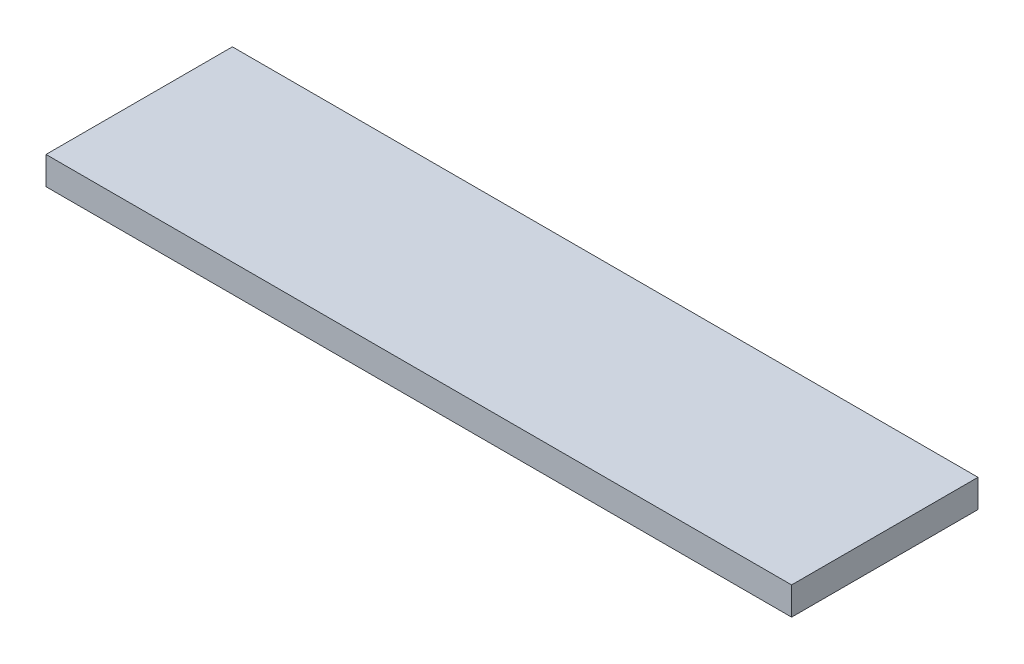
ISO-10303-21;
HEADER;
FILE_DESCRIPTION(('STEP AP214'),'2;1');
FILE_NAME('part.step','',(''),(''),'','','');
FILE_SCHEMA(('AUTOMOTIVE_DESIGN { 1 0 10303 214 1 1 1 1 }'));
ENDSEC;
DATA;
#1=APPLICATION_CONTEXT('core data for automotive mechanical design processes');
#2=APPLICATION_PROTOCOL_DEFINITION('international standard','automotive_design',2000,#1);
#3=PRODUCT_CONTEXT('',#1,'mechanical');
#4=PRODUCT('Part','Part','',(#3));
#5=PRODUCT_RELATED_PRODUCT_CATEGORY('part','',(#4));
#6=PRODUCT_DEFINITION_FORMATION('','',#4);
#7=PRODUCT_DEFINITION_CONTEXT('part definition',#1,'design');
#8=PRODUCT_DEFINITION('design','',#6,#7);
#9=PRODUCT_DEFINITION_SHAPE('','',#8);
#10=(LENGTH_UNIT() NAMED_UNIT(*) SI_UNIT(.MILLI.,.METRE.));
#11=(NAMED_UNIT(*) PLANE_ANGLE_UNIT() SI_UNIT($,.RADIAN.));
#12=(NAMED_UNIT(*) SI_UNIT($,.STERADIAN.) SOLID_ANGLE_UNIT());
#13=UNCERTAINTY_MEASURE_WITH_UNIT(LENGTH_MEASURE(1.E-05),#10,'distance_accuracy_value','');
#14=(GEOMETRIC_REPRESENTATION_CONTEXT(3) GLOBAL_UNCERTAINTY_ASSIGNED_CONTEXT((#13)) GLOBAL_UNIT_ASSIGNED_CONTEXT((#10,
#11,#12)) REPRESENTATION_CONTEXT('',''));
#15=CARTESIAN_POINT('',(0.,0.,0.));
#16=DIRECTION('',(0.,0.,1.));
#17=DIRECTION('',(1.,0.,0.));
#18=AXIS2_PLACEMENT_3D('',#15,#16,#17);
#19=CARTESIAN_POINT('',(-24.8447204968944,3.,-10.7453416149068));
#20=DIRECTION('',(1.,0.,0.));
#21=DIRECTION('',(0.,0.,-1.));
#22=AXIS2_PLACEMENT_3D('',#19,#20,#21);
#23=PLANE('',#22);
#24=DIRECTION('',(0.,0.,1.));
#25=VECTOR('',#24,1.);
#26=CARTESIAN_POINT('',(-24.8447204968944,0.,-10.7453416149068));
#27=LINE('',#26,#25);
#28=CARTESIAN_POINT('',(-24.8447204968944,0.,-10.7453416149068));
#29=VERTEX_POINT('',#28);
#30=CARTESIAN_POINT('',(-24.8447204968944,0.,9.25465838509317));
#31=VERTEX_POINT('',#30);
#32=EDGE_CURVE('E96',#29,#31,#27,.T.);
#33=ORIENTED_EDGE('',*,*,#32,.T.);
#34=DIRECTION('',(0.,-1.,0.));
#35=VECTOR('',#34,1.);
#36=CARTESIAN_POINT('',(-24.8447204968944,3.,9.25465838509317));
#37=LINE('',#36,#35);
#38=CARTESIAN_POINT('',(-24.8447204968944,3.,9.25465838509317));
#39=VERTEX_POINT('',#38);
#40=EDGE_CURVE('E11',#39,#31,#37,.T.);
#41=ORIENTED_EDGE('',*,*,#40,.F.);
#42=DIRECTION('',(0.,0.,1.));
#43=VECTOR('',#42,1.);
#44=CARTESIAN_POINT('',(-24.8447204968944,3.,-10.7453416149068));
#45=LINE('',#44,#43);
#46=CARTESIAN_POINT('',(-24.8447204968944,3.,-10.7453416149068));
#47=VERTEX_POINT('',#46);
#48=EDGE_CURVE('E84',#47,#39,#45,.T.);
#49=ORIENTED_EDGE('',*,*,#48,.F.);
#50=DIRECTION('',(0.,-1.,0.));
#51=VECTOR('',#50,1.);
#52=CARTESIAN_POINT('',(-24.8447204968944,3.,-10.7453416149068));
#53=LINE('',#52,#51);
#54=EDGE_CURVE('E92',#47,#29,#53,.T.);
#55=ORIENTED_EDGE('',*,*,#54,.T.);
#56=EDGE_LOOP('',(#33,#41,#49,#55));
#57=FACE_BOUND('',#56,.T.);
#58=ADVANCED_FACE('F33',(#57),#23,.F.);
#59=CARTESIAN_POINT('',(-24.8447204968944,3.,9.25465838509317));
#60=DIRECTION('',(0.,0.,-1.));
#61=DIRECTION('',(-1.,0.,0.));
#62=AXIS2_PLACEMENT_3D('',#59,#60,#61);
#63=PLANE('',#62);
#64=DIRECTION('',(1.,0.,0.));
#65=VECTOR('',#64,1.);
#66=CARTESIAN_POINT('',(-24.8447204968944,0.,9.25465838509317));
#67=LINE('',#66,#65);
#68=CARTESIAN_POINT('',(55.1552795031056,0.,9.25465838509317));
#69=VERTEX_POINT('',#68);
#70=EDGE_CURVE('E88',#31,#69,#67,.T.);
#71=ORIENTED_EDGE('',*,*,#70,.T.);
#72=DIRECTION('',(0.,-1.,0.));
#73=VECTOR('',#72,1.);
#74=CARTESIAN_POINT('',(55.1552795031056,3.,9.25465838509317));
#75=LINE('',#74,#73);
#76=CARTESIAN_POINT('',(55.1552795031056,3.,9.25465838509317));
#77=VERTEX_POINT('',#76);
#78=EDGE_CURVE('E41',#77,#69,#75,.T.);
#79=ORIENTED_EDGE('',*,*,#78,.F.);
#80=DIRECTION('',(1.,0.,0.));
#81=VECTOR('',#80,1.);
#82=CARTESIAN_POINT('',(-24.8447204968944,3.,9.25465838509317));
#83=LINE('',#82,#81);
#84=EDGE_CURVE('E79',#39,#77,#83,.T.);
#85=ORIENTED_EDGE('',*,*,#84,.F.);
#86=ORIENTED_EDGE('',*,*,#40,.T.);
#87=EDGE_LOOP('',(#71,#79,#85,#86));
#88=FACE_BOUND('',#87,.T.);
#89=ADVANCED_FACE('F87',(#88),#63,.F.);
#90=CARTESIAN_POINT('',(55.1552795031056,3.,-10.7453416149068));
#91=DIRECTION('',(-1.,0.,0.));
#92=DIRECTION('',(0.,0.,1.));
#93=AXIS2_PLACEMENT_3D('',#90,#91,#92);
#94=PLANE('',#93);
#95=DIRECTION('',(0.,0.,-1.));
#96=VECTOR('',#95,1.);
#97=CARTESIAN_POINT('',(55.1552795031056,0.,-10.7453416149068));
#98=LINE('',#97,#96);
#99=CARTESIAN_POINT('',(55.1552795031056,0.,-10.7453416149068));
#100=VERTEX_POINT('',#99);
#101=EDGE_CURVE('E66',#69,#100,#98,.T.);
#102=ORIENTED_EDGE('',*,*,#101,.T.);
#103=DIRECTION('',(0.,-1.,0.));
#104=VECTOR('',#103,1.);
#105=CARTESIAN_POINT('',(55.1552795031056,3.,-10.7453416149068));
#106=LINE('',#105,#104);
#107=CARTESIAN_POINT('',(55.1552795031056,3.,-10.7453416149068));
#108=VERTEX_POINT('',#107);
#109=EDGE_CURVE('E89',#108,#100,#106,.T.);
#110=ORIENTED_EDGE('',*,*,#109,.F.);
#111=DIRECTION('',(0.,0.,-1.));
#112=VECTOR('',#111,1.);
#113=CARTESIAN_POINT('',(55.1552795031056,3.,-10.7453416149068));
#114=LINE('',#113,#112);
#115=EDGE_CURVE('E82',#77,#108,#114,.T.);
#116=ORIENTED_EDGE('',*,*,#115,.F.);
#117=ORIENTED_EDGE('',*,*,#78,.T.);
#118=EDGE_LOOP('',(#102,#110,#116,#117));
#119=FACE_BOUND('',#118,.T.);
#120=ADVANCED_FACE('F90',(#119),#94,.F.);
#121=CARTESIAN_POINT('',(-24.8447204968944,3.,-10.7453416149068));
#122=DIRECTION('',(0.,0.,1.));
#123=DIRECTION('',(1.,0.,0.));
#124=AXIS2_PLACEMENT_3D('',#121,#122,#123);
#125=PLANE('',#124);
#126=DIRECTION('',(-1.,0.,0.));
#127=VECTOR('',#126,1.);
#128=CARTESIAN_POINT('',(-24.8447204968944,0.,-10.7453416149068));
#129=LINE('',#128,#127);
#130=EDGE_CURVE('E72',#100,#29,#129,.T.);
#131=ORIENTED_EDGE('',*,*,#130,.T.);
#132=ORIENTED_EDGE('',*,*,#54,.F.);
#133=DIRECTION('',(-1.,0.,0.));
#134=VECTOR('',#133,1.);
#135=CARTESIAN_POINT('',(-24.8447204968944,3.,-10.7453416149068));
#136=LINE('',#135,#134);
#137=EDGE_CURVE('E49',#108,#47,#136,.T.);
#138=ORIENTED_EDGE('',*,*,#137,.F.);
#139=ORIENTED_EDGE('',*,*,#109,.T.);
#140=EDGE_LOOP('',(#131,#132,#138,#139));
#141=FACE_BOUND('',#140,.T.);
#142=ADVANCED_FACE('F103',(#141),#125,.F.);
#143=CARTESIAN_POINT('',(0.,3.,0.));
#144=DIRECTION('',(0.,1.,0.));
#145=DIRECTION('',(0.,0.,1.));
#146=AXIS2_PLACEMENT_3D('',#143,#144,#145);
#147=PLANE('',#146);
#148=ORIENTED_EDGE('',*,*,#48,.T.);
#149=ORIENTED_EDGE('',*,*,#84,.T.);
#150=ORIENTED_EDGE('',*,*,#115,.T.);
#151=ORIENTED_EDGE('',*,*,#137,.T.);
#152=EDGE_LOOP('',(#148,#149,#150,#151));
#153=FACE_BOUND('',#152,.T.);
#154=ADVANCED_FACE('F80',(#153),#147,.T.);
#155=CARTESIAN_POINT('',(0.,0.,0.));
#156=DIRECTION('',(0.,1.,0.));
#157=DIRECTION('',(0.,0.,1.));
#158=AXIS2_PLACEMENT_3D('',#155,#156,#157);
#159=PLANE('',#158);
#160=ORIENTED_EDGE('',*,*,#32,.F.);
#161=ORIENTED_EDGE('',*,*,#130,.F.);
#162=ORIENTED_EDGE('',*,*,#101,.F.);
#163=ORIENTED_EDGE('',*,*,#70,.F.);
#164=EDGE_LOOP('',(#160,#161,#162,#163));
#165=FACE_BOUND('',#164,.T.);
#166=ADVANCED_FACE('F106',(#165),#159,.F.);
#167=CLOSED_SHELL('',(#58,#89,#120,#142,#154,#166));
#168=MANIFOLD_SOLID_BREP('B2',#167);
#169=ADVANCED_BREP_SHAPE_REPRESENTATION('',(#18,#168),#14);
#170=SHAPE_DEFINITION_REPRESENTATION(#9,#169);
ENDSEC;
END-ISO-10303-21;
